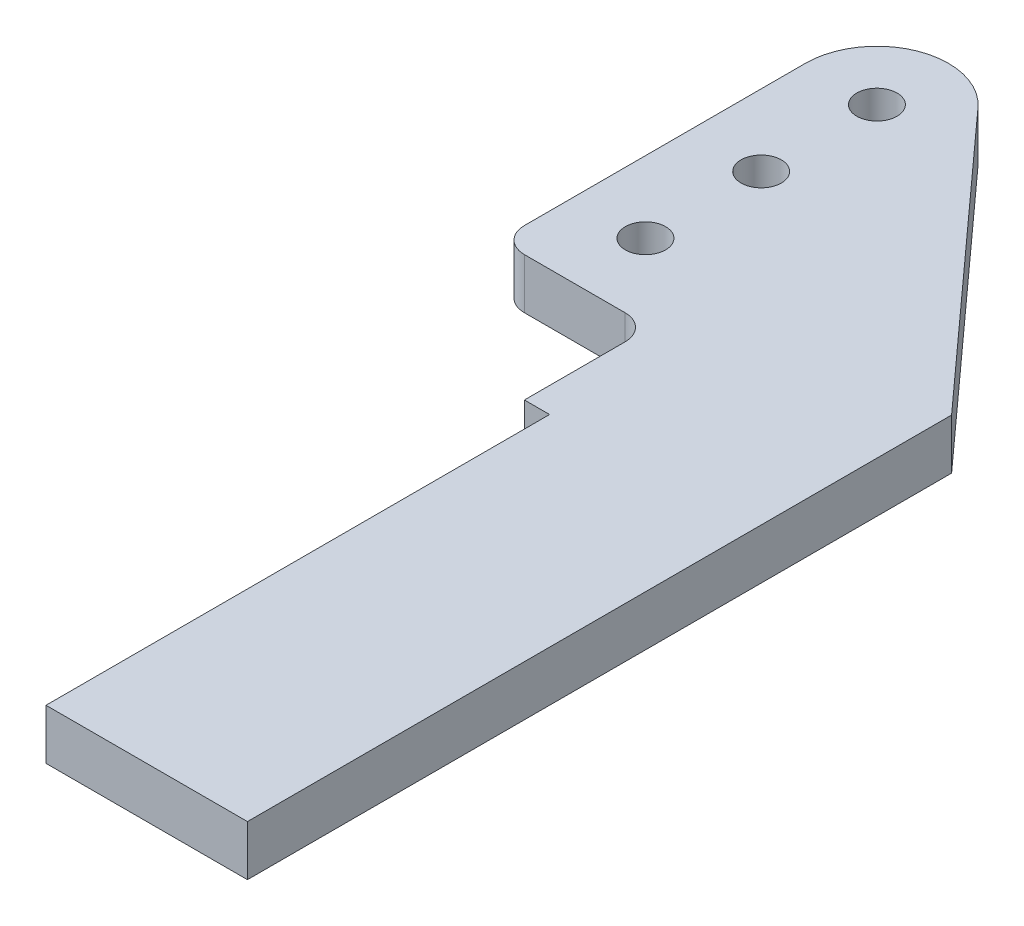
ISO-10303-21;
HEADER;
FILE_DESCRIPTION(('STEP AP214'),'2;1');
FILE_NAME('part.step','',(''),(''),'','','');
FILE_SCHEMA(('AUTOMOTIVE_DESIGN { 1 0 10303 214 1 1 1 1 }'));
ENDSEC;
DATA;
#1=APPLICATION_CONTEXT('core data for automotive mechanical design processes');
#2=APPLICATION_PROTOCOL_DEFINITION('international standard','automotive_design',2000,#1);
#3=PRODUCT_CONTEXT('',#1,'mechanical');
#4=PRODUCT('Part','Part','',(#3));
#5=PRODUCT_RELATED_PRODUCT_CATEGORY('part','',(#4));
#6=PRODUCT_DEFINITION_FORMATION('','',#4);
#7=PRODUCT_DEFINITION_CONTEXT('part definition',#1,'design');
#8=PRODUCT_DEFINITION('design','',#6,#7);
#9=PRODUCT_DEFINITION_SHAPE('','',#8);
#10=(LENGTH_UNIT() NAMED_UNIT(*) SI_UNIT(.MILLI.,.METRE.));
#11=(NAMED_UNIT(*) PLANE_ANGLE_UNIT() SI_UNIT($,.RADIAN.));
#12=(NAMED_UNIT(*) SI_UNIT($,.STERADIAN.) SOLID_ANGLE_UNIT());
#13=UNCERTAINTY_MEASURE_WITH_UNIT(LENGTH_MEASURE(1.E-05),#10,'distance_accuracy_value','');
#14=(GEOMETRIC_REPRESENTATION_CONTEXT(3) GLOBAL_UNCERTAINTY_ASSIGNED_CONTEXT((#13)) GLOBAL_UNIT_ASSIGNED_CONTEXT((#10,
#11,#12)) REPRESENTATION_CONTEXT('',''));
#15=CARTESIAN_POINT('',(0.,0.,0.));
#16=DIRECTION('',(0.,0.,1.));
#17=DIRECTION('',(1.,0.,0.));
#18=AXIS2_PLACEMENT_3D('',#15,#16,#17);
#19=CARTESIAN_POINT('',(0.,2.,0.));
#20=DIRECTION('',(0.,0.,-1.));
#21=DIRECTION('',(-1.,0.,0.));
#22=AXIS2_PLACEMENT_3D('',#19,#20,#21);
#23=PLANE('',#22);
#24=DIRECTION('',(1.,0.,0.));
#25=VECTOR('',#24,1.);
#26=CARTESIAN_POINT('',(0.,0.,0.));
#27=LINE('',#26,#25);
#28=CARTESIAN_POINT('',(1.00000000000001,0.,0.));
#29=VERTEX_POINT('',#28);
#30=CARTESIAN_POINT('',(5.,0.,0.));
#31=VERTEX_POINT('',#30);
#32=EDGE_CURVE('E174',#29,#31,#27,.T.);
#33=ORIENTED_EDGE('',*,*,#32,.T.);
#34=DIRECTION('',(0.,-1.,0.));
#35=VECTOR('',#34,1.);
#36=CARTESIAN_POINT('',(5.,2.,0.));
#37=LINE('',#36,#35);
#38=CARTESIAN_POINT('',(5.,2.,0.));
#39=VERTEX_POINT('',#38);
#40=EDGE_CURVE('E11',#39,#31,#37,.T.);
#41=ORIENTED_EDGE('',*,*,#40,.F.);
#42=DIRECTION('',(1.,0.,0.));
#43=VECTOR('',#42,1.);
#44=CARTESIAN_POINT('',(0.,2.,0.));
#45=LINE('',#44,#43);
#46=CARTESIAN_POINT('',(1.00000000000001,2.,0.));
#47=VERTEX_POINT('',#46);
#48=EDGE_CURVE('E261',#47,#39,#45,.T.);
#49=ORIENTED_EDGE('',*,*,#48,.F.);
#50=DIRECTION('',(0.,-1.,0.));
#51=VECTOR('',#50,1.);
#52=CARTESIAN_POINT('',(1.00000000000001,2.,0.));
#53=LINE('',#52,#51);
#54=EDGE_CURVE('E59',#47,#29,#53,.T.);
#55=ORIENTED_EDGE('',*,*,#54,.T.);
#56=EDGE_LOOP('',(#33,#41,#49,#55));
#57=FACE_BOUND('',#56,.T.);
#58=ADVANCED_FACE('F41',(#57),#23,.F.);
#59=CARTESIAN_POINT('',(5.,2.,1.));
#60=DIRECTION('',(0.,-1.,0.));
#61=DIRECTION('',(0.,0.,-1.));
#62=AXIS2_PLACEMENT_3D('',#59,#60,#61);
#63=CYLINDRICAL_SURFACE('',#62,1.);
#64=CARTESIAN_POINT('',(5.,0.,1.));
#65=DIRECTION('',(0.,1.,0.));
#66=DIRECTION('',(0.,0.,1.));
#67=AXIS2_PLACEMENT_3D('',#64,#65,#66);
#68=CIRCLE('',#67,1.);
#69=CARTESIAN_POINT('',(6.,0.,1.));
#70=VERTEX_POINT('',#69);
#71=EDGE_CURVE('E177',#31,#70,#68,.F.);
#72=ORIENTED_EDGE('',*,*,#71,.T.);
#73=DIRECTION('',(0.,-1.,0.));
#74=VECTOR('',#73,1.);
#75=CARTESIAN_POINT('',(6.,2.,1.));
#76=LINE('',#75,#74);
#77=CARTESIAN_POINT('',(6.,2.,1.));
#78=VERTEX_POINT('',#77);
#79=EDGE_CURVE('E51',#78,#70,#76,.T.);
#80=ORIENTED_EDGE('',*,*,#79,.F.);
#81=CARTESIAN_POINT('',(5.,2.,1.));
#82=DIRECTION('',(0.,1.,0.));
#83=DIRECTION('',(0.,0.,1.));
#84=AXIS2_PLACEMENT_3D('',#81,#82,#83);
#85=CIRCLE('',#84,1.);
#86=EDGE_CURVE('E106',#39,#78,#85,.F.);
#87=ORIENTED_EDGE('',*,*,#86,.F.);
#88=ORIENTED_EDGE('',*,*,#40,.T.);
#89=EDGE_LOOP('',(#72,#80,#87,#88));
#90=FACE_BOUND('',#89,.T.);
#91=ADVANCED_FACE('F242',(#90),#63,.F.);
#92=CARTESIAN_POINT('',(6.,2.,0.));
#93=DIRECTION('',(-1.,0.,0.));
#94=DIRECTION('',(0.,0.,1.));
#95=AXIS2_PLACEMENT_3D('',#92,#93,#94);
#96=PLANE('',#95);
#97=DIRECTION('',(0.,0.,-1.));
#98=VECTOR('',#97,1.);
#99=CARTESIAN_POINT('',(6.,0.,0.));
#100=LINE('',#99,#98);
#101=CARTESIAN_POINT('',(6.,0.,5.));
#102=VERTEX_POINT('',#101);
#103=EDGE_CURVE('E181',#102,#70,#100,.T.);
#104=ORIENTED_EDGE('',*,*,#103,.F.);
#105=DIRECTION('',(0.,-1.,0.));
#106=VECTOR('',#105,1.);
#107=CARTESIAN_POINT('',(6.,2.,5.));
#108=LINE('',#107,#106);
#109=CARTESIAN_POINT('',(6.,2.,5.));
#110=VERTEX_POINT('',#109);
#111=EDGE_CURVE('E233',#110,#102,#108,.T.);
#112=ORIENTED_EDGE('',*,*,#111,.F.);
#113=DIRECTION('',(0.,0.,-1.));
#114=VECTOR('',#113,1.);
#115=CARTESIAN_POINT('',(6.,2.,0.));
#116=LINE('',#115,#114);
#117=EDGE_CURVE('E241',#110,#78,#116,.T.);
#118=ORIENTED_EDGE('',*,*,#117,.T.);
#119=ORIENTED_EDGE('',*,*,#79,.T.);
#120=EDGE_LOOP('',(#104,#112,#118,#119));
#121=FACE_BOUND('',#120,.T.);
#122=ADVANCED_FACE('F239',(#121),#96,.T.);
#123=CARTESIAN_POINT('',(0.,2.,5.));
#124=DIRECTION('',(0.,0.,1.));
#125=DIRECTION('',(1.,0.,0.));
#126=AXIS2_PLACEMENT_3D('',#123,#124,#125);
#127=PLANE('',#126);
#128=DIRECTION('',(-1.,0.,0.));
#129=VECTOR('',#128,1.);
#130=CARTESIAN_POINT('',(0.,0.,5.));
#131=LINE('',#130,#129);
#132=CARTESIAN_POINT('',(7.,0.,5.));
#133=VERTEX_POINT('',#132);
#134=EDGE_CURVE('E185',#133,#102,#131,.T.);
#135=ORIENTED_EDGE('',*,*,#134,.F.);
#136=DIRECTION('',(0.,-1.,0.));
#137=VECTOR('',#136,1.);
#138=CARTESIAN_POINT('',(7.,2.,5.));
#139=LINE('',#138,#137);
#140=CARTESIAN_POINT('',(7.,2.,5.));
#141=VERTEX_POINT('',#140);
#142=EDGE_CURVE('E230',#141,#133,#139,.T.);
#143=ORIENTED_EDGE('',*,*,#142,.F.);
#144=DIRECTION('',(-1.,0.,0.));
#145=VECTOR('',#144,1.);
#146=CARTESIAN_POINT('',(0.,2.,5.));
#147=LINE('',#146,#145);
#148=EDGE_CURVE('E252',#141,#110,#147,.T.);
#149=ORIENTED_EDGE('',*,*,#148,.T.);
#150=ORIENTED_EDGE('',*,*,#111,.T.);
#151=EDGE_LOOP('',(#135,#143,#149,#150));
#152=FACE_BOUND('',#151,.T.);
#153=ADVANCED_FACE('F249',(#152),#127,.T.);
#154=CARTESIAN_POINT('',(7.,2.,0.));
#155=DIRECTION('',(-1.,0.,0.));
#156=DIRECTION('',(0.,0.,1.));
#157=AXIS2_PLACEMENT_3D('',#154,#155,#156);
#158=PLANE('',#157);
#159=DIRECTION('',(0.,0.,-1.));
#160=VECTOR('',#159,1.);
#161=CARTESIAN_POINT('',(7.,0.,0.));
#162=LINE('',#161,#160);
#163=CARTESIAN_POINT('',(7.,0.,25.));
#164=VERTEX_POINT('',#163);
#165=EDGE_CURVE('E189',#164,#133,#162,.T.);
#166=ORIENTED_EDGE('',*,*,#165,.F.);
#167=DIRECTION('',(0.,-1.,0.));
#168=VECTOR('',#167,1.);
#169=CARTESIAN_POINT('',(7.,2.,25.));
#170=LINE('',#169,#168);
#171=CARTESIAN_POINT('',(7.,2.,25.));
#172=VERTEX_POINT('',#171);
#173=EDGE_CURVE('E227',#172,#164,#170,.T.);
#174=ORIENTED_EDGE('',*,*,#173,.F.);
#175=DIRECTION('',(0.,0.,-1.));
#176=VECTOR('',#175,1.);
#177=CARTESIAN_POINT('',(7.,2.,0.));
#178=LINE('',#177,#176);
#179=EDGE_CURVE('E259',#172,#141,#178,.T.);
#180=ORIENTED_EDGE('',*,*,#179,.T.);
#181=ORIENTED_EDGE('',*,*,#142,.T.);
#182=EDGE_LOOP('',(#166,#174,#180,#181));
#183=FACE_BOUND('',#182,.T.);
#184=ADVANCED_FACE('F390',(#183),#158,.T.);
#185=CARTESIAN_POINT('',(0.,2.,25.));
#186=DIRECTION('',(0.,0.,1.));
#187=DIRECTION('',(1.,0.,0.));
#188=AXIS2_PLACEMENT_3D('',#185,#186,#187);
#189=PLANE('',#188);
#190=DIRECTION('',(-1.,0.,0.));
#191=VECTOR('',#190,1.);
#192=CARTESIAN_POINT('',(0.,0.,25.));
#193=LINE('',#192,#191);
#194=CARTESIAN_POINT('',(15.,0.,25.));
#195=VERTEX_POINT('',#194);
#196=EDGE_CURVE('E193',#195,#164,#193,.T.);
#197=ORIENTED_EDGE('',*,*,#196,.F.);
#198=DIRECTION('',(0.,-1.,0.));
#199=VECTOR('',#198,1.);
#200=CARTESIAN_POINT('',(15.,2.,25.));
#201=LINE('',#200,#199);
#202=CARTESIAN_POINT('',(15.,2.,25.));
#203=VERTEX_POINT('',#202);
#204=EDGE_CURVE('E224',#203,#195,#201,.T.);
#205=ORIENTED_EDGE('',*,*,#204,.F.);
#206=DIRECTION('',(-1.,0.,0.));
#207=VECTOR('',#206,1.);
#208=CARTESIAN_POINT('',(0.,2.,25.));
#209=LINE('',#208,#207);
#210=EDGE_CURVE('E267',#203,#172,#209,.T.);
#211=ORIENTED_EDGE('',*,*,#210,.T.);
#212=ORIENTED_EDGE('',*,*,#173,.T.);
#213=EDGE_LOOP('',(#197,#205,#211,#212));
#214=FACE_BOUND('',#213,.T.);
#215=ADVANCED_FACE('F380',(#214),#189,.T.);
#216=CARTESIAN_POINT('',(15.,2.,0.));
#217=DIRECTION('',(1.,0.,0.));
#218=DIRECTION('',(0.,0.,-1.));
#219=AXIS2_PLACEMENT_3D('',#216,#217,#218);
#220=PLANE('',#219);
#221=DIRECTION('',(0.,0.,1.));
#222=VECTOR('',#221,1.);
#223=CARTESIAN_POINT('',(15.,0.,0.));
#224=LINE('',#223,#222);
#225=CARTESIAN_POINT('',(15.,0.,-2.96531153245265));
#226=VERTEX_POINT('',#225);
#227=EDGE_CURVE('E197',#226,#195,#224,.T.);
#228=ORIENTED_EDGE('',*,*,#227,.F.);
#229=DIRECTION('',(0.,-1.,0.));
#230=VECTOR('',#229,1.);
#231=CARTESIAN_POINT('',(15.,2.,-2.96531153245265));
#232=LINE('',#231,#230);
#233=CARTESIAN_POINT('',(15.,2.,-2.96531153245265));
#234=VERTEX_POINT('',#233);
#235=EDGE_CURVE('E221',#234,#226,#232,.T.);
#236=ORIENTED_EDGE('',*,*,#235,.F.);
#237=DIRECTION('',(0.,0.,1.));
#238=VECTOR('',#237,1.);
#239=CARTESIAN_POINT('',(15.,2.,0.));
#240=LINE('',#239,#238);
#241=EDGE_CURVE('E271',#234,#203,#240,.T.);
#242=ORIENTED_EDGE('',*,*,#241,.T.);
#243=ORIENTED_EDGE('',*,*,#204,.T.);
#244=EDGE_LOOP('',(#228,#236,#242,#243));
#245=FACE_BOUND('',#244,.T.);
#246=ADVANCED_FACE('F371',(#245),#220,.T.);
#247=CARTESIAN_POINT('',(9.71738480741464,2.,-8.79917630108242));
#248=DIRECTION('',(0.741260319241546,0.,-0.671217654057104));
#249=DIRECTION('',(-0.671217654057104,0.,-0.741260319241545));
#250=AXIS2_PLACEMENT_3D('',#247,#248,#249);
#251=PLANE('',#250);
#252=DIRECTION('',(0.671217654057104,0.,0.741260319241545));
#253=VECTOR('',#252,1.);
#254=CARTESIAN_POINT('',(9.71738480741464,0.,-8.79917630108242));
#255=LINE('',#254,#253);
#256=CARTESIAN_POINT('',(4.94857749127781,0.,-14.0656164970375));
#257=VERTEX_POINT('',#256);
#258=EDGE_CURVE('E201',#257,#226,#255,.T.);
#259=ORIENTED_EDGE('',*,*,#258,.F.);
#260=DIRECTION('',(0.,-1.,0.));
#261=VECTOR('',#260,1.);
#262=CARTESIAN_POINT('',(4.94857749127781,2.,-14.0656164970375));
#263=LINE('',#262,#261);
#264=CARTESIAN_POINT('',(4.94857749127781,2.,-14.0656164970375));
#265=VERTEX_POINT('',#264);
#266=EDGE_CURVE('E141',#265,#257,#263,.T.);
#267=ORIENTED_EDGE('',*,*,#266,.F.);
#268=DIRECTION('',(0.671217654057104,0.,0.741260319241545));
#269=VECTOR('',#268,1.);
#270=CARTESIAN_POINT('',(9.71738480741464,2.,-8.79917630108242));
#271=LINE('',#270,#269);
#272=EDGE_CURVE('E151',#265,#234,#271,.T.);
#273=ORIENTED_EDGE('',*,*,#272,.T.);
#274=ORIENTED_EDGE('',*,*,#235,.T.);
#275=EDGE_LOOP('',(#259,#267,#273,#274));
#276=FACE_BOUND('',#275,.T.);
#277=ADVANCED_FACE('F277',(#276),#251,.T.);
#278=CARTESIAN_POINT('',(2.84195156611235,2.,-12.1580484338876));
#279=DIRECTION('',(0.,-1.,0.));
#280=DIRECTION('',(0.,0.,-1.));
#281=AXIS2_PLACEMENT_3D('',#278,#279,#280);
#282=CYLINDRICAL_SURFACE('',#281,2.84195156611236);
#283=CARTESIAN_POINT('',(2.84195156611235,0.,-12.1580484338876));
#284=DIRECTION('',(0.,1.,0.));
#285=DIRECTION('',(0.,0.,1.));
#286=AXIS2_PLACEMENT_3D('',#283,#284,#285);
#287=CIRCLE('',#286,2.84195156611236);
#288=CARTESIAN_POINT('',(0.,0.,-12.1580484338876));
#289=VERTEX_POINT('',#288);
#290=EDGE_CURVE('E136',#289,#257,#287,.F.);
#291=ORIENTED_EDGE('',*,*,#290,.F.);
#292=DIRECTION('',(0.,-1.,0.));
#293=VECTOR('',#292,1.);
#294=CARTESIAN_POINT('',(0.,2.,-12.1580484338876));
#295=LINE('',#294,#293);
#296=CARTESIAN_POINT('',(0.,2.,-12.1580484338876));
#297=VERTEX_POINT('',#296);
#298=EDGE_CURVE('E131',#297,#289,#295,.T.);
#299=ORIENTED_EDGE('',*,*,#298,.F.);
#300=CARTESIAN_POINT('',(2.84195156611235,2.,-12.1580484338876));
#301=DIRECTION('',(0.,1.,0.));
#302=DIRECTION('',(0.,0.,1.));
#303=AXIS2_PLACEMENT_3D('',#300,#301,#302);
#304=CIRCLE('',#303,2.84195156611236);
#305=EDGE_CURVE('E134',#297,#265,#304,.F.);
#306=ORIENTED_EDGE('',*,*,#305,.T.);
#307=ORIENTED_EDGE('',*,*,#266,.T.);
#308=EDGE_LOOP('',(#291,#299,#306,#307));
#309=FACE_BOUND('',#308,.T.);
#310=ADVANCED_FACE('F133',(#309),#282,.T.);
#311=CARTESIAN_POINT('',(0.,2.,0.));
#312=DIRECTION('',(-1.,0.,0.));
#313=DIRECTION('',(0.,0.,1.));
#314=AXIS2_PLACEMENT_3D('',#311,#312,#313);
#315=PLANE('',#314);
#316=DIRECTION('',(0.,0.,-1.));
#317=VECTOR('',#316,1.);
#318=CARTESIAN_POINT('',(0.,0.,0.));
#319=LINE('',#318,#317);
#320=CARTESIAN_POINT('',(0.,0.,-1.00000000000001));
#321=VERTEX_POINT('',#320);
#322=EDGE_CURVE('E207',#321,#289,#319,.T.);
#323=ORIENTED_EDGE('',*,*,#322,.F.);
#324=DIRECTION('',(0.,-1.,0.));
#325=VECTOR('',#324,1.);
#326=CARTESIAN_POINT('',(0.,2.,-1.00000000000001));
#327=LINE('',#326,#325);
#328=CARTESIAN_POINT('',(0.,2.,-1.00000000000001));
#329=VERTEX_POINT('',#328);
#330=EDGE_CURVE('E94',#329,#321,#327,.T.);
#331=ORIENTED_EDGE('',*,*,#330,.F.);
#332=DIRECTION('',(0.,0.,-1.));
#333=VECTOR('',#332,1.);
#334=CARTESIAN_POINT('',(0.,2.,0.));
#335=LINE('',#334,#333);
#336=EDGE_CURVE('E148',#329,#297,#335,.T.);
#337=ORIENTED_EDGE('',*,*,#336,.T.);
#338=ORIENTED_EDGE('',*,*,#298,.T.);
#339=EDGE_LOOP('',(#323,#331,#337,#338));
#340=FACE_BOUND('',#339,.T.);
#341=ADVANCED_FACE('F154',(#340),#315,.T.);
#342=CARTESIAN_POINT('',(2.84195156611235,2.,-12.1580484338876));
#343=DIRECTION('',(0.,-1.,0.));
#344=DIRECTION('',(0.,0.,-1.));
#345=AXIS2_PLACEMENT_3D('',#342,#343,#344);
#346=CYLINDRICAL_SURFACE('',#345,0.8);
#347=CARTESIAN_POINT('',(2.84195156611235,2.,-12.1580484338876));
#348=DIRECTION('',(0.,1.,0.));
#349=DIRECTION('',(0.,0.,1.));
#350=AXIS2_PLACEMENT_3D('',#347,#348,#349);
#351=CIRCLE('',#350,0.8);
#352=CARTESIAN_POINT('',(2.84195156611235,2.,-11.3580484338876));
#353=VERTEX_POINT('',#352);
#354=EDGE_CURVE('E437',#353,#353,#351,.T.);
#355=ORIENTED_EDGE('',*,*,#354,.T.);
#356=EDGE_LOOP('',(#355));
#357=FACE_BOUND('',#356,.T.);
#358=CARTESIAN_POINT('',(2.84195156611235,0.,-12.1580484338876));
#359=DIRECTION('',(0.,1.,0.));
#360=DIRECTION('',(0.,0.,1.));
#361=AXIS2_PLACEMENT_3D('',#358,#359,#360);
#362=CIRCLE('',#361,0.8);
#363=CARTESIAN_POINT('',(2.84195156611235,0.,-11.3580484338876));
#364=VERTEX_POINT('',#363);
#365=EDGE_CURVE('E170',#364,#364,#362,.T.);
#366=ORIENTED_EDGE('',*,*,#365,.F.);
#367=EDGE_LOOP('',(#366));
#368=FACE_BOUND('',#367,.T.);
#369=ADVANCED_FACE('F300',(#357,#368),#346,.F.);
#370=CARTESIAN_POINT('',(2.84195156611235,2.,-2.96531153245265));
#371=DIRECTION('',(0.,-1.,0.));
#372=DIRECTION('',(0.,0.,-1.));
#373=AXIS2_PLACEMENT_3D('',#370,#371,#372);
#374=CYLINDRICAL_SURFACE('',#373,0.8);
#375=CARTESIAN_POINT('',(2.84195156611235,2.,-2.96531153245265));
#376=DIRECTION('',(0.,1.,0.));
#377=DIRECTION('',(0.,0.,1.));
#378=AXIS2_PLACEMENT_3D('',#375,#376,#377);
#379=CIRCLE('',#378,0.8);
#380=CARTESIAN_POINT('',(2.84195156611235,2.,-2.16531153245265));
#381=VERTEX_POINT('',#380);
#382=EDGE_CURVE('E310',#381,#381,#379,.T.);
#383=ORIENTED_EDGE('',*,*,#382,.T.);
#384=EDGE_LOOP('',(#383));
#385=FACE_BOUND('',#384,.T.);
#386=CARTESIAN_POINT('',(2.84195156611235,0.,-2.96531153245265));
#387=DIRECTION('',(0.,1.,0.));
#388=DIRECTION('',(0.,0.,1.));
#389=AXIS2_PLACEMENT_3D('',#386,#387,#388);
#390=CIRCLE('',#389,0.8);
#391=CARTESIAN_POINT('',(2.84195156611235,0.,-2.16531153245265));
#392=VERTEX_POINT('',#391);
#393=EDGE_CURVE('E166',#392,#392,#390,.T.);
#394=ORIENTED_EDGE('',*,*,#393,.F.);
#395=EDGE_LOOP('',(#394));
#396=FACE_BOUND('',#395,.T.);
#397=ADVANCED_FACE('F288',(#385,#396),#374,.F.);
#398=CARTESIAN_POINT('',(2.84195156611235,2.,-7.56167998317015));
#399=DIRECTION('',(0.,-1.,0.));
#400=DIRECTION('',(0.,0.,-1.));
#401=AXIS2_PLACEMENT_3D('',#398,#399,#400);
#402=CYLINDRICAL_SURFACE('',#401,0.8);
#403=CARTESIAN_POINT('',(2.84195156611235,2.,-7.56167998317015));
#404=DIRECTION('',(0.,1.,0.));
#405=DIRECTION('',(0.,0.,1.));
#406=AXIS2_PLACEMENT_3D('',#403,#404,#405);
#407=CIRCLE('',#406,0.8);
#408=CARTESIAN_POINT('',(2.84195156611235,2.,-6.76167998317015));
#409=VERTEX_POINT('',#408);
#410=EDGE_CURVE('E214',#409,#409,#407,.T.);
#411=ORIENTED_EDGE('',*,*,#410,.T.);
#412=EDGE_LOOP('',(#411));
#413=FACE_BOUND('',#412,.T.);
#414=CARTESIAN_POINT('',(2.84195156611235,0.,-7.56167998317015));
#415=DIRECTION('',(0.,1.,0.));
#416=DIRECTION('',(0.,0.,1.));
#417=AXIS2_PLACEMENT_3D('',#414,#415,#416);
#418=CIRCLE('',#417,0.8);
#419=CARTESIAN_POINT('',(2.84195156611235,0.,-6.76167998317015));
#420=VERTEX_POINT('',#419);
#421=EDGE_CURVE('E162',#420,#420,#418,.T.);
#422=ORIENTED_EDGE('',*,*,#421,.F.);
#423=EDGE_LOOP('',(#422));
#424=FACE_BOUND('',#423,.T.);
#425=ADVANCED_FACE('F43',(#413,#424),#402,.F.);
#426=CARTESIAN_POINT('',(1.,2.,-1.));
#427=DIRECTION('',(0.,-1.,0.));
#428=DIRECTION('',(0.,0.,-1.));
#429=AXIS2_PLACEMENT_3D('',#426,#427,#428);
#430=CYLINDRICAL_SURFACE('',#429,1.);
#431=CARTESIAN_POINT('',(1.,0.,-1.));
#432=DIRECTION('',(0.,1.,0.));
#433=DIRECTION('',(0.,0.,1.));
#434=AXIS2_PLACEMENT_3D('',#431,#432,#433);
#435=CIRCLE('',#434,1.);
#436=EDGE_CURVE('E210',#29,#321,#435,.F.);
#437=ORIENTED_EDGE('',*,*,#436,.F.);
#438=ORIENTED_EDGE('',*,*,#54,.F.);
#439=CARTESIAN_POINT('',(1.,2.,-1.));
#440=DIRECTION('',(0.,1.,0.));
#441=DIRECTION('',(0.,0.,1.));
#442=AXIS2_PLACEMENT_3D('',#439,#440,#441);
#443=CIRCLE('',#442,1.);
#444=EDGE_CURVE('E156',#47,#329,#443,.F.);
#445=ORIENTED_EDGE('',*,*,#444,.T.);
#446=ORIENTED_EDGE('',*,*,#330,.T.);
#447=EDGE_LOOP('',(#437,#438,#445,#446));
#448=FACE_BOUND('',#447,.T.);
#449=ADVANCED_FACE('F279',(#448),#430,.T.);
#450=CARTESIAN_POINT('',(0.,2.,0.));
#451=DIRECTION('',(0.,1.,0.));
#452=DIRECTION('',(0.,0.,1.));
#453=AXIS2_PLACEMENT_3D('',#450,#451,#452);
#454=PLANE('',#453);
#455=ORIENTED_EDGE('',*,*,#410,.F.);
#456=EDGE_LOOP('',(#455));
#457=FACE_BOUND('',#456,.T.);
#458=ORIENTED_EDGE('',*,*,#382,.F.);
#459=EDGE_LOOP('',(#458));
#460=FACE_BOUND('',#459,.T.);
#461=ORIENTED_EDGE('',*,*,#354,.F.);
#462=EDGE_LOOP('',(#461));
#463=FACE_BOUND('',#462,.T.);
#464=ORIENTED_EDGE('',*,*,#48,.T.);
#465=ORIENTED_EDGE('',*,*,#86,.T.);
#466=ORIENTED_EDGE('',*,*,#117,.F.);
#467=ORIENTED_EDGE('',*,*,#148,.F.);
#468=ORIENTED_EDGE('',*,*,#179,.F.);
#469=ORIENTED_EDGE('',*,*,#210,.F.);
#470=ORIENTED_EDGE('',*,*,#241,.F.);
#471=ORIENTED_EDGE('',*,*,#272,.F.);
#472=ORIENTED_EDGE('',*,*,#305,.F.);
#473=ORIENTED_EDGE('',*,*,#336,.F.);
#474=ORIENTED_EDGE('',*,*,#444,.F.);
#475=EDGE_LOOP('',(#464,#465,#466,#467,#468,#469,#470,#471,#472,#473,#474));
#476=FACE_BOUND('',#475,.T.);
#477=ADVANCED_FACE('F146',(#457,#460,#463,#476),#454,.T.);
#478=CARTESIAN_POINT('',(0.,0.,0.));
#479=DIRECTION('',(0.,1.,0.));
#480=DIRECTION('',(0.,0.,1.));
#481=AXIS2_PLACEMENT_3D('',#478,#479,#480);
#482=PLANE('',#481);
#483=ORIENTED_EDGE('',*,*,#421,.T.);
#484=EDGE_LOOP('',(#483));
#485=FACE_BOUND('',#484,.T.);
#486=ORIENTED_EDGE('',*,*,#393,.T.);
#487=EDGE_LOOP('',(#486));
#488=FACE_BOUND('',#487,.T.);
#489=ORIENTED_EDGE('',*,*,#365,.T.);
#490=EDGE_LOOP('',(#489));
#491=FACE_BOUND('',#490,.T.);
#492=ORIENTED_EDGE('',*,*,#32,.F.);
#493=ORIENTED_EDGE('',*,*,#436,.T.);
#494=ORIENTED_EDGE('',*,*,#322,.T.);
#495=ORIENTED_EDGE('',*,*,#290,.T.);
#496=ORIENTED_EDGE('',*,*,#258,.T.);
#497=ORIENTED_EDGE('',*,*,#227,.T.);
#498=ORIENTED_EDGE('',*,*,#196,.T.);
#499=ORIENTED_EDGE('',*,*,#165,.T.);
#500=ORIENTED_EDGE('',*,*,#134,.T.);
#501=ORIENTED_EDGE('',*,*,#103,.T.);
#502=ORIENTED_EDGE('',*,*,#71,.F.);
#503=EDGE_LOOP('',(#492,#493,#494,#495,#496,#497,#498,#499,#500,#501,#502));
#504=FACE_BOUND('',#503,.T.);
#505=ADVANCED_FACE('F245',(#485,#488,#491,#504),#482,.F.);
#506=CLOSED_SHELL('',(#58,#91,#122,#153,#184,#215,#246,#277,#310,#341,#369,#397,#425,#449,#477,#505));
#507=MANIFOLD_SOLID_BREP('B2',#506);
#508=ADVANCED_BREP_SHAPE_REPRESENTATION('',(#18,#507),#14);
#509=SHAPE_DEFINITION_REPRESENTATION(#9,#508);
ENDSEC;
END-ISO-10303-21;
